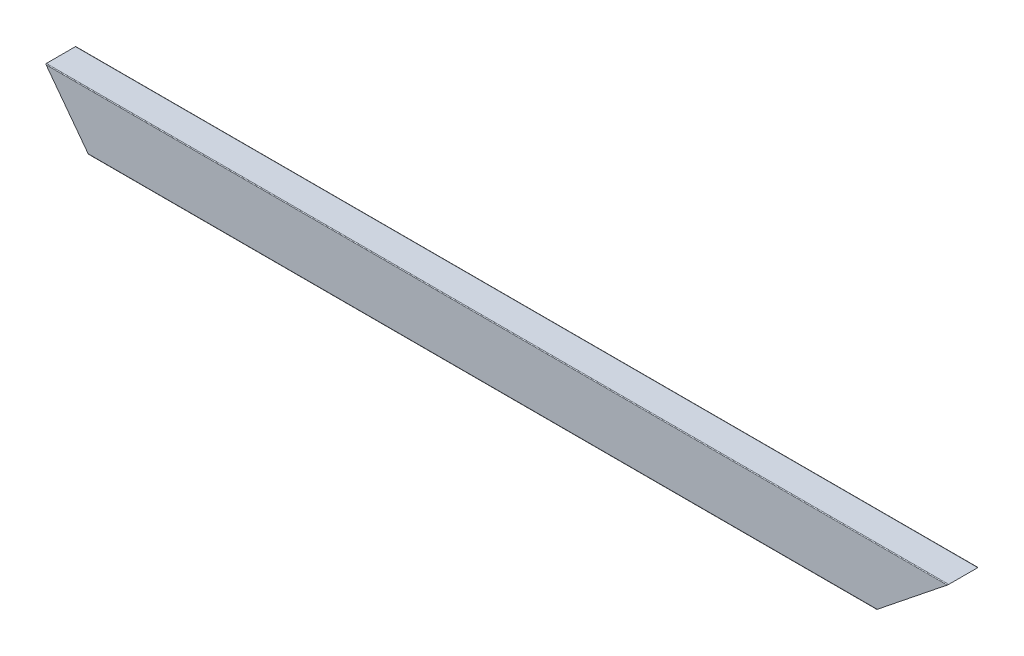
ISO-10303-21;
HEADER;
FILE_DESCRIPTION(('STEP AP214'),'2;1');
FILE_NAME('part.step','',(''),(''),'','','');
FILE_SCHEMA(('AUTOMOTIVE_DESIGN { 1 0 10303 214 1 1 1 1 }'));
ENDSEC;
DATA;
#1=APPLICATION_CONTEXT('core data for automotive mechanical design processes');
#2=APPLICATION_PROTOCOL_DEFINITION('international standard','automotive_design',2000,#1);
#3=PRODUCT_CONTEXT('',#1,'mechanical');
#4=PRODUCT('Part','Part','',(#3));
#5=PRODUCT_RELATED_PRODUCT_CATEGORY('part','',(#4));
#6=PRODUCT_DEFINITION_FORMATION('','',#4);
#7=PRODUCT_DEFINITION_CONTEXT('part definition',#1,'design');
#8=PRODUCT_DEFINITION('design','',#6,#7);
#9=PRODUCT_DEFINITION_SHAPE('','',#8);
#10=(LENGTH_UNIT() NAMED_UNIT(*) SI_UNIT(.MILLI.,.METRE.));
#11=(NAMED_UNIT(*) PLANE_ANGLE_UNIT() SI_UNIT($,.RADIAN.));
#12=(NAMED_UNIT(*) SI_UNIT($,.STERADIAN.) SOLID_ANGLE_UNIT());
#13=UNCERTAINTY_MEASURE_WITH_UNIT(LENGTH_MEASURE(1.E-05),#10,'distance_accuracy_value','');
#14=(GEOMETRIC_REPRESENTATION_CONTEXT(3) GLOBAL_UNCERTAINTY_ASSIGNED_CONTEXT((#13)) GLOBAL_UNIT_ASSIGNED_CONTEXT((#10,
#11,#12)) REPRESENTATION_CONTEXT('',''));
#15=CARTESIAN_POINT('',(0.,0.,0.));
#16=DIRECTION('',(0.,0.,1.));
#17=DIRECTION('',(1.,0.,0.));
#18=AXIS2_PLACEMENT_3D('',#15,#16,#17);
#19=CARTESIAN_POINT('',(349.25,-25.4,-13.49375));
#20=DIRECTION('',(0.624695047554421,-0.780868809443033,0.));
#21=DIRECTION('',(0.780868809443033,0.624695047554421,0.));
#22=AXIS2_PLACEMENT_3D('',#19,#20,#21);
#23=PLANE('',#22);
#24=DIRECTION('',(0.,0.,-1.));
#25=VECTOR('',#24,1.);
#26=CARTESIAN_POINT('',(351.482421875,-23.6140625,-13.49375));
#27=LINE('',#26,#25);
#28=CARTESIAN_POINT('',(351.482421875,-23.6140625,10.53703125));
#29=VERTEX_POINT('',#28);
#30=CARTESIAN_POINT('',(351.482421875,-23.6140625,-10.53703125));
#31=VERTEX_POINT('',#30);
#32=EDGE_CURVE('E267',#29,#31,#27,.T.);
#33=ORIENTED_EDGE('',*,*,#32,.F.);
#34=CARTESIAN_POINT('',(353.069921875,-22.3440625,10.53703125));
#35=DIRECTION('',(0.624695047554421,-0.780868809443033,0.));
#36=DIRECTION('',(-0.780868809443033,-0.624695047554421,0.));
#37=AXIS2_PLACEMENT_3D('',#34,#35,#36);
#38=ELLIPSE('',#37,2.03299194538494,1.27);
#39=CARTESIAN_POINT('',(353.069921875,-22.3440625,11.80703125));
#40=VERTEX_POINT('',#39);
#41=EDGE_CURVE('E162',#29,#40,#38,.F.);
#42=ORIENTED_EDGE('',*,*,#41,.T.);
#43=DIRECTION('',(-0.780868809443033,-0.624695047554421,0.));
#44=VECTOR('',#43,1.);
#45=CARTESIAN_POINT('',(349.25,-25.4,11.80703125));
#46=LINE('',#45,#44);
#47=CARTESIAN_POINT('',(408.930078125,22.3440625,11.80703125));
#48=VERTEX_POINT('',#47);
#49=EDGE_CURVE('E293',#48,#40,#46,.T.);
#50=ORIENTED_EDGE('',*,*,#49,.F.);
#51=CARTESIAN_POINT('',(408.930078125,22.3440625,10.53703125));
#52=DIRECTION('',(0.624695047554421,-0.780868809443033,0.));
#53=DIRECTION('',(0.780868809443033,0.624695047554421,0.));
#54=AXIS2_PLACEMENT_3D('',#51,#52,#53);
#55=ELLIPSE('',#54,2.03299194538494,1.27);
#56=CARTESIAN_POINT('',(410.517578125,23.6140625,10.53703125));
#57=VERTEX_POINT('',#56);
#58=EDGE_CURVE('E200',#48,#57,#55,.F.);
#59=ORIENTED_EDGE('',*,*,#58,.T.);
#60=DIRECTION('',(0.,0.,-1.));
#61=VECTOR('',#60,1.);
#62=CARTESIAN_POINT('',(410.517578125,23.6140625,-13.49375));
#63=LINE('',#62,#61);
#64=CARTESIAN_POINT('',(410.517578125,23.6140625,-10.53703125));
#65=VERTEX_POINT('',#64);
#66=EDGE_CURVE('E298',#57,#65,#63,.T.);
#67=ORIENTED_EDGE('',*,*,#66,.T.);
#68=CARTESIAN_POINT('',(408.930078125,22.3440625,-10.53703125));
#69=DIRECTION('',(0.624695047554421,-0.780868809443033,0.));
#70=DIRECTION('',(-0.780868809443033,-0.624695047554421,0.));
#71=AXIS2_PLACEMENT_3D('',#68,#69,#70);
#72=ELLIPSE('',#71,2.03299194538494,1.27);
#73=CARTESIAN_POINT('',(408.930078125,22.3440625,-11.80703125));
#74=VERTEX_POINT('',#73);
#75=EDGE_CURVE('E204',#65,#74,#72,.F.);
#76=ORIENTED_EDGE('',*,*,#75,.T.);
#77=DIRECTION('',(-0.780868809443033,-0.624695047554421,0.));
#78=VECTOR('',#77,1.);
#79=CARTESIAN_POINT('',(349.25,-25.4,-11.80703125));
#80=LINE('',#79,#78);
#81=CARTESIAN_POINT('',(353.069921875,-22.3440625,-11.80703125));
#82=VERTEX_POINT('',#81);
#83=EDGE_CURVE('E301',#74,#82,#80,.T.);
#84=ORIENTED_EDGE('',*,*,#83,.T.);
#85=CARTESIAN_POINT('',(353.069921875,-22.3440625,-10.53703125));
#86=DIRECTION('',(0.624695047554421,-0.780868809443033,0.));
#87=DIRECTION('',(0.780868809443033,0.624695047554421,0.));
#88=AXIS2_PLACEMENT_3D('',#85,#86,#87);
#89=ELLIPSE('',#88,2.03299194538494,1.27);
#90=EDGE_CURVE('E163',#82,#31,#89,.F.);
#91=ORIENTED_EDGE('',*,*,#90,.T.);
#92=EDGE_LOOP('',(#33,#42,#50,#59,#67,#76,#84,#91));
#93=FACE_BOUND('',#92,.T.);
#94=DIRECTION('',(0.780868809443033,0.624695047554421,0.));
#95=VECTOR('',#94,1.);
#96=CARTESIAN_POINT('',(349.25,-25.4,13.49375));
#97=LINE('',#96,#95);
#98=CARTESIAN_POINT('',(350.04375,-24.765,13.49375));
#99=VERTEX_POINT('',#98);
#100=CARTESIAN_POINT('',(411.95625,24.765,13.49375));
#101=VERTEX_POINT('',#100);
#102=EDGE_CURVE('E261',#99,#101,#97,.T.);
#103=ORIENTED_EDGE('',*,*,#102,.F.);
#104=CARTESIAN_POINT('',(350.04375,-24.765,12.85875));
#105=DIRECTION('',(0.624695047554421,-0.780868809443033,0.));
#106=DIRECTION('',(0.780868809443033,0.624695047554421,0.));
#107=AXIS2_PLACEMENT_3D('',#104,#105,#106);
#108=ELLIPSE('',#107,1.01649597269247,0.635);
#109=CARTESIAN_POINT('',(349.25,-25.4,12.85875));
#110=VERTEX_POINT('',#109);
#111=EDGE_CURVE('E220',#99,#110,#108,.T.);
#112=ORIENTED_EDGE('',*,*,#111,.T.);
#113=DIRECTION('',(0.,0.,1.));
#114=VECTOR('',#113,1.);
#115=CARTESIAN_POINT('',(349.25,-25.4,-13.49375));
#116=LINE('',#115,#114);
#117=CARTESIAN_POINT('',(349.25,-25.4,-12.85875));
#118=VERTEX_POINT('',#117);
#119=EDGE_CURVE('E174',#118,#110,#116,.T.);
#120=ORIENTED_EDGE('',*,*,#119,.F.);
#121=CARTESIAN_POINT('',(350.04375,-24.765,-12.85875));
#122=DIRECTION('',(0.624695047554421,-0.780868809443033,0.));
#123=DIRECTION('',(-0.780868809443033,-0.624695047554421,0.));
#124=AXIS2_PLACEMENT_3D('',#121,#122,#123);
#125=ELLIPSE('',#124,1.01649597269247,0.635);
#126=CARTESIAN_POINT('',(350.04375,-24.765,-13.49375));
#127=VERTEX_POINT('',#126);
#128=EDGE_CURVE('E218',#118,#127,#125,.T.);
#129=ORIENTED_EDGE('',*,*,#128,.T.);
#130=DIRECTION('',(0.780868809443033,0.624695047554421,0.));
#131=VECTOR('',#130,1.);
#132=CARTESIAN_POINT('',(349.25,-25.4,-13.49375));
#133=LINE('',#132,#131);
#134=CARTESIAN_POINT('',(411.95625,24.765,-13.49375));
#135=VERTEX_POINT('',#134);
#136=EDGE_CURVE('E264',#127,#135,#133,.T.);
#137=ORIENTED_EDGE('',*,*,#136,.T.);
#138=CARTESIAN_POINT('',(411.95625,24.765,-12.85875));
#139=DIRECTION('',(0.624695047554421,-0.780868809443033,0.));
#140=DIRECTION('',(0.780868809443033,0.624695047554421,0.));
#141=AXIS2_PLACEMENT_3D('',#138,#139,#140);
#142=ELLIPSE('',#141,1.01649597269247,0.635);
#143=CARTESIAN_POINT('',(412.75,25.4,-12.85875));
#144=VERTEX_POINT('',#143);
#145=EDGE_CURVE('E216',#135,#144,#142,.T.);
#146=ORIENTED_EDGE('',*,*,#145,.T.);
#147=DIRECTION('',(0.,0.,1.));
#148=VECTOR('',#147,1.);
#149=CARTESIAN_POINT('',(412.75,25.4,-13.49375));
#150=LINE('',#149,#148);
#151=CARTESIAN_POINT('',(412.75,25.4,12.85875));
#152=VERTEX_POINT('',#151);
#153=EDGE_CURVE('E242',#144,#152,#150,.T.);
#154=ORIENTED_EDGE('',*,*,#153,.T.);
#155=CARTESIAN_POINT('',(411.95625,24.765,12.85875));
#156=DIRECTION('',(0.624695047554421,-0.780868809443033,0.));
#157=DIRECTION('',(-0.780868809443033,-0.624695047554421,0.));
#158=AXIS2_PLACEMENT_3D('',#155,#156,#157);
#159=ELLIPSE('',#158,1.01649597269247,0.635);
#160=EDGE_CURVE('E214',#152,#101,#159,.T.);
#161=ORIENTED_EDGE('',*,*,#160,.T.);
#162=EDGE_LOOP('',(#103,#112,#120,#129,#137,#146,#154,#161));
#163=FACE_BOUND('',#162,.T.);
#164=ADVANCED_FACE('F37',(#93,#163),#23,.T.);
#165=CARTESIAN_POINT('',(-349.25,-25.4,-13.49375));
#166=DIRECTION('',(0.,-1.,0.));
#167=DIRECTION('',(0.,0.,-1.));
#168=AXIS2_PLACEMENT_3D('',#165,#166,#167);
#169=PLANE('',#168);
#170=ORIENTED_EDGE('',*,*,#119,.T.);
#171=DIRECTION('',(1.,0.,0.));
#172=VECTOR('',#171,1.);
#173=CARTESIAN_POINT('',(-349.25,-25.4,12.85875));
#174=LINE('',#173,#172);
#175=CARTESIAN_POINT('',(-349.25,-25.4,12.85875));
#176=VERTEX_POINT('',#175);
#177=EDGE_CURVE('E225',#110,#176,#174,.F.);
#178=ORIENTED_EDGE('',*,*,#177,.T.);
#179=DIRECTION('',(0.,0.,1.));
#180=VECTOR('',#179,1.);
#181=CARTESIAN_POINT('',(-349.25,-25.4,-13.49375));
#182=LINE('',#181,#180);
#183=CARTESIAN_POINT('',(-349.25,-25.4,-12.85875));
#184=VERTEX_POINT('',#183);
#185=EDGE_CURVE('E274',#184,#176,#182,.T.);
#186=ORIENTED_EDGE('',*,*,#185,.F.);
#187=DIRECTION('',(1.,0.,0.));
#188=VECTOR('',#187,1.);
#189=CARTESIAN_POINT('',(349.25,-25.4,-12.85875));
#190=LINE('',#189,#188);
#191=EDGE_CURVE('E222',#184,#118,#190,.T.);
#192=ORIENTED_EDGE('',*,*,#191,.T.);
#193=EDGE_LOOP('',(#170,#178,#186,#192));
#194=FACE_BOUND('',#193,.T.);
#195=ADVANCED_FACE('F325',(#194),#169,.T.);
#196=CARTESIAN_POINT('',(-349.25,-25.4,-13.49375));
#197=DIRECTION('',(-0.79974775659144,-0.600336177343127,0.));
#198=DIRECTION('',(0.600336177343127,-0.79974775659144,0.));
#199=AXIS2_PLACEMENT_3D('',#196,#197,#198);
#200=PLANE('',#199);
#201=DIRECTION('',(0.,0.,1.));
#202=VECTOR('',#201,1.);
#203=CARTESIAN_POINT('',(-350.590626319846,-23.6140625,-13.49375));
#204=LINE('',#203,#202);
#205=CARTESIAN_POINT('',(-350.590626319846,-23.6140625,-10.53703125));
#206=VERTEX_POINT('',#205);
#207=CARTESIAN_POINT('',(-350.590626319846,-23.6140625,10.53703125));
#208=VERTEX_POINT('',#207);
#209=EDGE_CURVE('E158',#206,#208,#204,.T.);
#210=ORIENTED_EDGE('',*,*,#209,.F.);
#211=CARTESIAN_POINT('',(-351.543960591736,-22.3440625,-10.53703125));
#212=DIRECTION('',(-0.79974775659144,-0.600336177343127,0.));
#213=DIRECTION('',(0.600336177343127,-0.79974775659144,0.));
#214=AXIS2_PLACEMENT_3D('',#211,#212,#213);
#215=ELLIPSE('',#214,1.58800070338777,1.27);
#216=CARTESIAN_POINT('',(-351.543960591736,-22.3440625,-11.80703125));
#217=VERTEX_POINT('',#216);
#218=EDGE_CURVE('E152',#206,#217,#215,.F.);
#219=ORIENTED_EDGE('',*,*,#218,.T.);
#220=DIRECTION('',(-0.600336177343127,0.79974775659144,0.));
#221=VECTOR('',#220,1.);
#222=CARTESIAN_POINT('',(-349.25,-25.4,-11.80703125));
#223=LINE('',#222,#221);
#224=CARTESIAN_POINT('',(-385.089410283865,22.3440625,-11.80703125));
#225=VERTEX_POINT('',#224);
#226=EDGE_CURVE('E155',#217,#225,#223,.T.);
#227=ORIENTED_EDGE('',*,*,#226,.T.);
#228=CARTESIAN_POINT('',(-385.089410283865,22.3440625,-10.53703125));
#229=DIRECTION('',(-0.79974775659144,-0.600336177343127,0.));
#230=DIRECTION('',(-0.600336177343127,0.79974775659144,0.));
#231=AXIS2_PLACEMENT_3D('',#228,#229,#230);
#232=ELLIPSE('',#231,1.58800070338777,1.27);
#233=CARTESIAN_POINT('',(-386.042744555755,23.6140625,-10.53703125));
#234=VERTEX_POINT('',#233);
#235=EDGE_CURVE('E206',#225,#234,#232,.F.);
#236=ORIENTED_EDGE('',*,*,#235,.T.);
#237=DIRECTION('',(0.,0.,1.));
#238=VECTOR('',#237,1.);
#239=CARTESIAN_POINT('',(-386.042744555755,23.6140625,-13.49375));
#240=LINE('',#239,#238);
#241=CARTESIAN_POINT('',(-386.042744555755,23.6140625,10.53703125));
#242=VERTEX_POINT('',#241);
#243=EDGE_CURVE('E173',#234,#242,#240,.T.);
#244=ORIENTED_EDGE('',*,*,#243,.T.);
#245=CARTESIAN_POINT('',(-385.089410283865,22.3440625,10.53703125));
#246=DIRECTION('',(-0.79974775659144,-0.600336177343127,0.));
#247=DIRECTION('',(0.600336177343127,-0.79974775659144,0.));
#248=AXIS2_PLACEMENT_3D('',#245,#246,#247);
#249=ELLIPSE('',#248,1.58800070338777,1.27);
#250=CARTESIAN_POINT('',(-385.089410283865,22.3440625,11.80703125));
#251=VERTEX_POINT('',#250);
#252=EDGE_CURVE('E202',#242,#251,#249,.F.);
#253=ORIENTED_EDGE('',*,*,#252,.T.);
#254=DIRECTION('',(-0.600336177343127,0.79974775659144,0.));
#255=VECTOR('',#254,1.);
#256=CARTESIAN_POINT('',(-349.25,-25.4,11.80703125));
#257=LINE('',#256,#255);
#258=CARTESIAN_POINT('',(-351.543960591735,-22.3440625,11.80703125));
#259=VERTEX_POINT('',#258);
#260=EDGE_CURVE('E279',#259,#251,#257,.T.);
#261=ORIENTED_EDGE('',*,*,#260,.F.);
#262=CARTESIAN_POINT('',(-351.543960591736,-22.3440625,10.53703125));
#263=DIRECTION('',(-0.79974775659144,-0.600336177343127,0.));
#264=DIRECTION('',(-0.600336177343127,0.79974775659144,0.));
#265=AXIS2_PLACEMENT_3D('',#262,#263,#264);
#266=ELLIPSE('',#265,1.58800070338777,1.27);
#267=EDGE_CURVE('E198',#259,#208,#266,.F.);
#268=ORIENTED_EDGE('',*,*,#267,.T.);
#269=EDGE_LOOP('',(#210,#219,#227,#236,#244,#253,#261,#268));
#270=FACE_BOUND('',#269,.T.);
#271=ORIENTED_EDGE('',*,*,#185,.T.);
#272=CARTESIAN_POINT('',(-349.726667135945,-24.765,12.85875));
#273=DIRECTION('',(-0.79974775659144,-0.600336177343127,0.));
#274=DIRECTION('',(0.600336177343127,-0.79974775659144,0.));
#275=AXIS2_PLACEMENT_3D('',#272,#273,#274);
#276=ELLIPSE('',#275,0.794000351693886,0.635);
#277=CARTESIAN_POINT('',(-349.726667135945,-24.765,13.49375));
#278=VERTEX_POINT('',#277);
#279=EDGE_CURVE('E232',#176,#278,#276,.T.);
#280=ORIENTED_EDGE('',*,*,#279,.T.);
#281=DIRECTION('',(0.600336177343127,-0.79974775659144,0.));
#282=VECTOR('',#281,1.);
#283=CARTESIAN_POINT('',(-349.25,-25.4,13.49375));
#284=LINE('',#283,#282);
#285=CARTESIAN_POINT('',(-386.906703739656,24.765,13.49375));
#286=VERTEX_POINT('',#285);
#287=EDGE_CURVE('E259',#286,#278,#284,.T.);
#288=ORIENTED_EDGE('',*,*,#287,.F.);
#289=CARTESIAN_POINT('',(-386.906703739656,24.765,12.85875));
#290=DIRECTION('',(-0.79974775659144,-0.600336177343127,0.));
#291=DIRECTION('',(-0.600336177343127,0.79974775659144,0.));
#292=AXIS2_PLACEMENT_3D('',#289,#290,#291);
#293=ELLIPSE('',#292,0.794000351693886,0.635);
#294=CARTESIAN_POINT('',(-387.383370875601,25.4,12.85875));
#295=VERTEX_POINT('',#294);
#296=EDGE_CURVE('E227',#286,#295,#293,.T.);
#297=ORIENTED_EDGE('',*,*,#296,.T.);
#298=DIRECTION('',(0.,0.,1.));
#299=VECTOR('',#298,1.);
#300=CARTESIAN_POINT('',(-387.383370875601,25.4,-13.49375));
#301=LINE('',#300,#299);
#302=CARTESIAN_POINT('',(-387.383370875601,25.4,-12.85875));
#303=VERTEX_POINT('',#302);
#304=EDGE_CURVE('E244',#303,#295,#301,.T.);
#305=ORIENTED_EDGE('',*,*,#304,.F.);
#306=CARTESIAN_POINT('',(-386.906703739656,24.765,-12.85875));
#307=DIRECTION('',(-0.79974775659144,-0.600336177343127,0.));
#308=DIRECTION('',(0.600336177343127,-0.79974775659144,0.));
#309=AXIS2_PLACEMENT_3D('',#306,#307,#308);
#310=ELLIPSE('',#309,0.794000351693886,0.635);
#311=CARTESIAN_POINT('',(-386.906703739656,24.765,-13.49375));
#312=VERTEX_POINT('',#311);
#313=EDGE_CURVE('E59',#303,#312,#310,.T.);
#314=ORIENTED_EDGE('',*,*,#313,.T.);
#315=DIRECTION('',(0.600336177343127,-0.79974775659144,0.));
#316=VECTOR('',#315,1.);
#317=CARTESIAN_POINT('',(-349.25,-25.4,-13.49375));
#318=LINE('',#317,#316);
#319=CARTESIAN_POINT('',(-349.726667135945,-24.765,-13.49375));
#320=VERTEX_POINT('',#319);
#321=EDGE_CURVE('E252',#312,#320,#318,.T.);
#322=ORIENTED_EDGE('',*,*,#321,.T.);
#323=CARTESIAN_POINT('',(-349.726667135945,-24.765,-12.85875));
#324=DIRECTION('',(-0.79974775659144,-0.600336177343127,0.));
#325=DIRECTION('',(-0.600336177343127,0.79974775659144,0.));
#326=AXIS2_PLACEMENT_3D('',#323,#324,#325);
#327=ELLIPSE('',#326,0.794000351693886,0.635);
#328=EDGE_CURVE('E230',#320,#184,#327,.T.);
#329=ORIENTED_EDGE('',*,*,#328,.T.);
#330=EDGE_LOOP('',(#271,#280,#288,#297,#305,#314,#322,#329));
#331=FACE_BOUND('',#330,.T.);
#332=ADVANCED_FACE('F154',(#270,#331),#200,.T.);
#333=CARTESIAN_POINT('',(-387.383370875601,25.4,-13.49375));
#334=DIRECTION('',(0.,1.,0.));
#335=DIRECTION('',(0.,0.,1.));
#336=AXIS2_PLACEMENT_3D('',#333,#334,#335);
#337=PLANE('',#336);
#338=ORIENTED_EDGE('',*,*,#153,.F.);
#339=DIRECTION('',(-1.,0.,0.));
#340=VECTOR('',#339,1.);
#341=CARTESIAN_POINT('',(-387.383370875601,25.4,-12.85875));
#342=LINE('',#341,#340);
#343=EDGE_CURVE('E11',#144,#303,#342,.T.);
#344=ORIENTED_EDGE('',*,*,#343,.T.);
#345=ORIENTED_EDGE('',*,*,#304,.T.);
#346=DIRECTION('',(-1.,0.,0.));
#347=VECTOR('',#346,1.);
#348=CARTESIAN_POINT('',(-387.383370875601,25.4,12.85875));
#349=LINE('',#348,#347);
#350=EDGE_CURVE('E45',#295,#152,#349,.F.);
#351=ORIENTED_EDGE('',*,*,#350,.T.);
#352=EDGE_LOOP('',(#338,#344,#345,#351));
#353=FACE_BOUND('',#352,.T.);
#354=ADVANCED_FACE('F241',(#353),#337,.T.);
#355=CARTESIAN_POINT('',(0.,0.,-13.49375));
#356=DIRECTION('',(0.,0.,1.));
#357=DIRECTION('',(1.,0.,0.));
#358=AXIS2_PLACEMENT_3D('',#355,#356,#357);
#359=PLANE('',#358);
#360=ORIENTED_EDGE('',*,*,#136,.F.);
#361=DIRECTION('',(1.,0.,0.));
#362=VECTOR('',#361,1.);
#363=CARTESIAN_POINT('',(-349.25,-24.765,-13.49375));
#364=LINE('',#363,#362);
#365=EDGE_CURVE('E52',#127,#320,#364,.F.);
#366=ORIENTED_EDGE('',*,*,#365,.T.);
#367=ORIENTED_EDGE('',*,*,#321,.F.);
#368=DIRECTION('',(-1.,0.,0.));
#369=VECTOR('',#368,1.);
#370=CARTESIAN_POINT('',(412.75,24.765,-13.49375));
#371=LINE('',#370,#369);
#372=EDGE_CURVE('E234',#312,#135,#371,.F.);
#373=ORIENTED_EDGE('',*,*,#372,.T.);
#374=EDGE_LOOP('',(#360,#366,#367,#373));
#375=FACE_BOUND('',#374,.T.);
#376=ADVANCED_FACE('F350',(#375),#359,.F.);
#377=CARTESIAN_POINT('',(0.,0.,13.49375));
#378=DIRECTION('',(0.,0.,1.));
#379=DIRECTION('',(1.,0.,0.));
#380=AXIS2_PLACEMENT_3D('',#377,#378,#379);
#381=PLANE('',#380);
#382=ORIENTED_EDGE('',*,*,#287,.T.);
#383=DIRECTION('',(1.,0.,0.));
#384=VECTOR('',#383,1.);
#385=CARTESIAN_POINT('',(0.,-24.765,13.49375));
#386=LINE('',#385,#384);
#387=EDGE_CURVE('E211',#278,#99,#386,.T.);
#388=ORIENTED_EDGE('',*,*,#387,.T.);
#389=ORIENTED_EDGE('',*,*,#102,.T.);
#390=DIRECTION('',(-1.,0.,0.));
#391=VECTOR('',#390,1.);
#392=CARTESIAN_POINT('',(0.,24.765,13.49375));
#393=LINE('',#392,#391);
#394=EDGE_CURVE('E208',#101,#286,#393,.T.);
#395=ORIENTED_EDGE('',*,*,#394,.T.);
#396=EDGE_LOOP('',(#382,#388,#389,#395));
#397=FACE_BOUND('',#396,.T.);
#398=ADVANCED_FACE('F258',(#397),#381,.T.);
#399=CARTESIAN_POINT('',(-387.383370875601,-23.6140625,11.80703125));
#400=DIRECTION('',(0.,-1.,0.));
#401=DIRECTION('',(0.,0.,-1.));
#402=AXIS2_PLACEMENT_3D('',#399,#400,#401);
#403=PLANE('',#402);
#404=ORIENTED_EDGE('',*,*,#32,.T.);
#405=DIRECTION('',(1.,0.,0.));
#406=VECTOR('',#405,1.);
#407=CARTESIAN_POINT('',(-387.383370875601,-23.6140625,-10.53703125));
#408=LINE('',#407,#406);
#409=EDGE_CURVE('E180',#31,#206,#408,.F.);
#410=ORIENTED_EDGE('',*,*,#409,.T.);
#411=ORIENTED_EDGE('',*,*,#209,.T.);
#412=DIRECTION('',(1.,0.,0.));
#413=VECTOR('',#412,1.);
#414=CARTESIAN_POINT('',(351.482421874999,-23.6140625,10.53703125));
#415=LINE('',#414,#413);
#416=EDGE_CURVE('E177',#208,#29,#415,.T.);
#417=ORIENTED_EDGE('',*,*,#416,.T.);
#418=EDGE_LOOP('',(#404,#410,#411,#417));
#419=FACE_BOUND('',#418,.T.);
#420=ADVANCED_FACE('F284',(#419),#403,.F.);
#421=CARTESIAN_POINT('',(-387.383370875601,23.6140625,11.80703125));
#422=DIRECTION('',(0.,0.,1.));
#423=DIRECTION('',(0.,-1.,0.));
#424=AXIS2_PLACEMENT_3D('',#421,#422,#423);
#425=PLANE('',#424);
#426=ORIENTED_EDGE('',*,*,#49,.T.);
#427=DIRECTION('',(1.,0.,0.));
#428=VECTOR('',#427,1.);
#429=CARTESIAN_POINT('',(-350.590626319846,-22.3440625,11.80703125));
#430=LINE('',#429,#428);
#431=EDGE_CURVE('E189',#40,#259,#430,.F.);
#432=ORIENTED_EDGE('',*,*,#431,.T.);
#433=ORIENTED_EDGE('',*,*,#260,.T.);
#434=DIRECTION('',(1.,0.,0.));
#435=VECTOR('',#434,1.);
#436=CARTESIAN_POINT('',(-387.383370875601,22.3440625,11.80703125));
#437=LINE('',#436,#435);
#438=EDGE_CURVE('E186',#251,#48,#437,.T.);
#439=ORIENTED_EDGE('',*,*,#438,.T.);
#440=EDGE_LOOP('',(#426,#432,#433,#439));
#441=FACE_BOUND('',#440,.T.);
#442=ADVANCED_FACE('F295',(#441),#425,.F.);
#443=CARTESIAN_POINT('',(-387.383370875601,23.6140625,11.80703125));
#444=DIRECTION('',(0.,-1.,0.));
#445=DIRECTION('',(0.,0.,-1.));
#446=AXIS2_PLACEMENT_3D('',#443,#444,#445);
#447=PLANE('',#446);
#448=ORIENTED_EDGE('',*,*,#66,.F.);
#449=DIRECTION('',(1.,0.,0.));
#450=VECTOR('',#449,1.);
#451=CARTESIAN_POINT('',(-387.383370875601,23.6140625,10.53703125));
#452=LINE('',#451,#450);
#453=EDGE_CURVE('E194',#57,#242,#452,.F.);
#454=ORIENTED_EDGE('',*,*,#453,.T.);
#455=ORIENTED_EDGE('',*,*,#243,.F.);
#456=DIRECTION('',(1.,0.,0.));
#457=VECTOR('',#456,1.);
#458=CARTESIAN_POINT('',(410.517578125,23.6140625,-10.53703125));
#459=LINE('',#458,#457);
#460=EDGE_CURVE('E191',#234,#65,#459,.T.);
#461=ORIENTED_EDGE('',*,*,#460,.T.);
#462=EDGE_LOOP('',(#448,#454,#455,#461));
#463=FACE_BOUND('',#462,.T.);
#464=ADVANCED_FACE('F311',(#463),#447,.T.);
#465=CARTESIAN_POINT('',(-387.383370875601,23.6140625,-11.80703125));
#466=DIRECTION('',(0.,0.,1.));
#467=DIRECTION('',(0.,-1.,0.));
#468=AXIS2_PLACEMENT_3D('',#465,#466,#467);
#469=PLANE('',#468);
#470=ORIENTED_EDGE('',*,*,#226,.F.);
#471=DIRECTION('',(1.,0.,0.));
#472=VECTOR('',#471,1.);
#473=CARTESIAN_POINT('',(-387.383370875601,-22.3440625,-11.80703125));
#474=LINE('',#473,#472);
#475=EDGE_CURVE('E169',#217,#82,#474,.T.);
#476=ORIENTED_EDGE('',*,*,#475,.T.);
#477=ORIENTED_EDGE('',*,*,#83,.F.);
#478=DIRECTION('',(1.,0.,0.));
#479=VECTOR('',#478,1.);
#480=CARTESIAN_POINT('',(-386.042744555755,22.3440625,-11.80703125));
#481=LINE('',#480,#479);
#482=EDGE_CURVE('E172',#74,#225,#481,.F.);
#483=ORIENTED_EDGE('',*,*,#482,.T.);
#484=EDGE_LOOP('',(#470,#476,#477,#483));
#485=FACE_BOUND('',#484,.T.);
#486=ADVANCED_FACE('F167',(#485),#469,.T.);
#487=CARTESIAN_POINT('',(-387.383370875601,-22.3440625,-10.53703125));
#488=DIRECTION('',(1.,0.,0.));
#489=DIRECTION('',(0.,0.,-1.));
#490=AXIS2_PLACEMENT_3D('',#487,#488,#489);
#491=CYLINDRICAL_SURFACE('',#490,1.27);
#492=ORIENTED_EDGE('',*,*,#218,.F.);
#493=ORIENTED_EDGE('',*,*,#409,.F.);
#494=ORIENTED_EDGE('',*,*,#90,.F.);
#495=ORIENTED_EDGE('',*,*,#475,.F.);
#496=EDGE_LOOP('',(#492,#493,#494,#495));
#497=FACE_BOUND('',#496,.T.);
#498=ADVANCED_FACE('F176',(#497),#491,.F.);
#499=CARTESIAN_POINT('',(-387.383370875601,-22.3440625,10.53703125));
#500=DIRECTION('',(-1.,0.,0.));
#501=DIRECTION('',(0.,0.,1.));
#502=AXIS2_PLACEMENT_3D('',#499,#500,#501);
#503=CYLINDRICAL_SURFACE('',#502,1.27);
#504=ORIENTED_EDGE('',*,*,#267,.F.);
#505=ORIENTED_EDGE('',*,*,#431,.F.);
#506=ORIENTED_EDGE('',*,*,#41,.F.);
#507=ORIENTED_EDGE('',*,*,#416,.F.);
#508=EDGE_LOOP('',(#504,#505,#506,#507));
#509=FACE_BOUND('',#508,.T.);
#510=ADVANCED_FACE('F288',(#509),#503,.F.);
#511=CARTESIAN_POINT('',(-387.383370875601,22.3440625,10.53703125));
#512=DIRECTION('',(1.,0.,0.));
#513=DIRECTION('',(0.,0.,-1.));
#514=AXIS2_PLACEMENT_3D('',#511,#512,#513);
#515=CYLINDRICAL_SURFACE('',#514,1.27);
#516=ORIENTED_EDGE('',*,*,#252,.F.);
#517=ORIENTED_EDGE('',*,*,#453,.F.);
#518=ORIENTED_EDGE('',*,*,#58,.F.);
#519=ORIENTED_EDGE('',*,*,#438,.F.);
#520=EDGE_LOOP('',(#516,#517,#518,#519));
#521=FACE_BOUND('',#520,.T.);
#522=ADVANCED_FACE('F314',(#521),#515,.F.);
#523=CARTESIAN_POINT('',(-387.383370875601,22.3440625,-10.53703125));
#524=DIRECTION('',(-1.,0.,0.));
#525=DIRECTION('',(0.,0.,1.));
#526=AXIS2_PLACEMENT_3D('',#523,#524,#525);
#527=CYLINDRICAL_SURFACE('',#526,1.27);
#528=ORIENTED_EDGE('',*,*,#235,.F.);
#529=ORIENTED_EDGE('',*,*,#482,.F.);
#530=ORIENTED_EDGE('',*,*,#75,.F.);
#531=ORIENTED_EDGE('',*,*,#460,.F.);
#532=EDGE_LOOP('',(#528,#529,#530,#531));
#533=FACE_BOUND('',#532,.T.);
#534=ADVANCED_FACE('F305',(#533),#527,.F.);
#535=CARTESIAN_POINT('',(0.,-24.765,12.85875));
#536=DIRECTION('',(1.,0.,0.));
#537=DIRECTION('',(0.,0.,-1.));
#538=AXIS2_PLACEMENT_3D('',#535,#536,#537);
#539=CYLINDRICAL_SURFACE('',#538,0.635);
#540=ORIENTED_EDGE('',*,*,#279,.F.);
#541=ORIENTED_EDGE('',*,*,#177,.F.);
#542=ORIENTED_EDGE('',*,*,#111,.F.);
#543=ORIENTED_EDGE('',*,*,#387,.F.);
#544=EDGE_LOOP('',(#540,#541,#542,#543));
#545=FACE_BOUND('',#544,.T.);
#546=ADVANCED_FACE('F321',(#545),#539,.T.);
#547=CARTESIAN_POINT('',(-349.25,-24.765,-12.85875));
#548=DIRECTION('',(-1.,0.,0.));
#549=DIRECTION('',(0.,0.,1.));
#550=AXIS2_PLACEMENT_3D('',#547,#548,#549);
#551=CYLINDRICAL_SURFACE('',#550,0.635);
#552=ORIENTED_EDGE('',*,*,#328,.F.);
#553=ORIENTED_EDGE('',*,*,#365,.F.);
#554=ORIENTED_EDGE('',*,*,#128,.F.);
#555=ORIENTED_EDGE('',*,*,#191,.F.);
#556=EDGE_LOOP('',(#552,#553,#554,#555));
#557=FACE_BOUND('',#556,.T.);
#558=ADVANCED_FACE('F469',(#557),#551,.T.);
#559=CARTESIAN_POINT('',(-387.383370875601,24.765,-12.85875));
#560=DIRECTION('',(1.,0.,0.));
#561=DIRECTION('',(0.,0.,-1.));
#562=AXIS2_PLACEMENT_3D('',#559,#560,#561);
#563=CYLINDRICAL_SURFACE('',#562,0.635);
#564=ORIENTED_EDGE('',*,*,#145,.F.);
#565=ORIENTED_EDGE('',*,*,#372,.F.);
#566=ORIENTED_EDGE('',*,*,#313,.F.);
#567=ORIENTED_EDGE('',*,*,#343,.F.);
#568=EDGE_LOOP('',(#564,#565,#566,#567));
#569=FACE_BOUND('',#568,.T.);
#570=ADVANCED_FACE('F478',(#569),#563,.T.);
#571=CARTESIAN_POINT('',(0.,24.765,12.85875));
#572=DIRECTION('',(-1.,0.,0.));
#573=DIRECTION('',(0.,0.,1.));
#574=AXIS2_PLACEMENT_3D('',#571,#572,#573);
#575=CYLINDRICAL_SURFACE('',#574,0.635);
#576=ORIENTED_EDGE('',*,*,#160,.F.);
#577=ORIENTED_EDGE('',*,*,#350,.F.);
#578=ORIENTED_EDGE('',*,*,#296,.F.);
#579=ORIENTED_EDGE('',*,*,#394,.F.);
#580=EDGE_LOOP('',(#576,#577,#578,#579));
#581=FACE_BOUND('',#580,.T.);
#582=ADVANCED_FACE('F39',(#581),#575,.T.);
#583=CLOSED_SHELL('',(#164,#195,#332,#354,#376,#398,#420,#442,#464,#486,#498,#510,#522,#534,
#546,#558,#570,#582));
#584=MANIFOLD_SOLID_BREP('B2',#583);
#585=ADVANCED_BREP_SHAPE_REPRESENTATION('',(#18,#584),#14);
#586=SHAPE_DEFINITION_REPRESENTATION(#9,#585);
ENDSEC;
END-ISO-10303-21;
